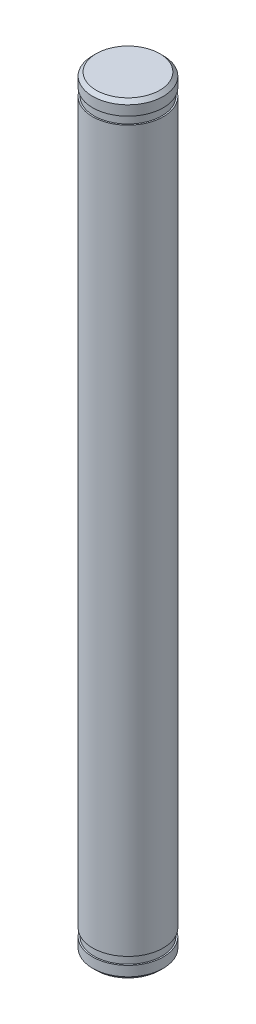
ISO-10303-21;
HEADER;
FILE_DESCRIPTION(('STEP AP214'),'2;1');
FILE_NAME('part.step','',(''),(''),'','','');
FILE_SCHEMA(('AUTOMOTIVE_DESIGN { 1 0 10303 214 1 1 1 1 }'));
ENDSEC;
DATA;
#1=APPLICATION_CONTEXT('core data for automotive mechanical design processes');
#2=APPLICATION_PROTOCOL_DEFINITION('international standard','automotive_design',2000,#1);
#3=PRODUCT_CONTEXT('',#1,'mechanical');
#4=PRODUCT('Part','Part','',(#3));
#5=PRODUCT_RELATED_PRODUCT_CATEGORY('part','',(#4));
#6=PRODUCT_DEFINITION_FORMATION('','',#4);
#7=PRODUCT_DEFINITION_CONTEXT('part definition',#1,'design');
#8=PRODUCT_DEFINITION('design','',#6,#7);
#9=PRODUCT_DEFINITION_SHAPE('','',#8);
#10=(LENGTH_UNIT() NAMED_UNIT(*) SI_UNIT(.MILLI.,.METRE.));
#11=(NAMED_UNIT(*) PLANE_ANGLE_UNIT() SI_UNIT($,.RADIAN.));
#12=(NAMED_UNIT(*) SI_UNIT($,.STERADIAN.) SOLID_ANGLE_UNIT());
#13=UNCERTAINTY_MEASURE_WITH_UNIT(LENGTH_MEASURE(1.E-05),#10,'distance_accuracy_value','');
#14=(GEOMETRIC_REPRESENTATION_CONTEXT(3) GLOBAL_UNCERTAINTY_ASSIGNED_CONTEXT((#13)) GLOBAL_UNIT_ASSIGNED_CONTEXT((#10,
#11,#12)) REPRESENTATION_CONTEXT('',''));
#15=CARTESIAN_POINT('',(0.,0.,0.));
#16=DIRECTION('',(0.,0.,1.));
#17=DIRECTION('',(1.,0.,0.));
#18=AXIS2_PLACEMENT_3D('',#15,#16,#17);
#19=CARTESIAN_POINT('',(0.,108.,0.));
#20=DIRECTION('',(0.,-1.,0.));
#21=DIRECTION('',(0.,0.,-1.));
#22=AXIS2_PLACEMENT_3D('',#19,#20,#21);
#23=CYLINDRICAL_SURFACE('',#22,5.);
#24=CARTESIAN_POINT('',(0.,105.,0.));
#25=DIRECTION('',(0.,1.,0.));
#26=DIRECTION('',(0.,0.,1.));
#27=AXIS2_PLACEMENT_3D('',#24,#25,#26);
#28=CIRCLE('',#27,5.);
#29=CARTESIAN_POINT('',(0.,105.,5.));
#30=VERTEX_POINT('',#29);
#31=EDGE_CURVE('E57',#30,#30,#28,.T.);
#32=ORIENTED_EDGE('',*,*,#31,.F.);
#33=EDGE_LOOP('',(#32));
#34=FACE_BOUND('',#33,.T.);
#35=CARTESIAN_POINT('',(0.,3.,0.));
#36=DIRECTION('',(0.,1.,0.));
#37=DIRECTION('',(0.,0.,1.));
#38=AXIS2_PLACEMENT_3D('',#35,#36,#37);
#39=CIRCLE('',#38,5.);
#40=CARTESIAN_POINT('',(0.,3.,5.));
#41=VERTEX_POINT('',#40);
#42=EDGE_CURVE('E69',#41,#41,#39,.T.);
#43=ORIENTED_EDGE('',*,*,#42,.T.);
#44=EDGE_LOOP('',(#43));
#45=FACE_BOUND('',#44,.T.);
#46=ADVANCED_FACE('F35',(#34,#45),#23,.T.);
#47=CARTESIAN_POINT('',(0.,106.1,0.));
#48=DIRECTION('',(0.,1.,0.));
#49=DIRECTION('',(0.,0.,1.));
#50=AXIS2_PLACEMENT_3D('',#47,#48,#49);
#51=CIRCLE('',#50,5.);
#52=CARTESIAN_POINT('',(0.,106.1,5.));
#53=VERTEX_POINT('',#52);
#54=EDGE_CURVE('E56',#53,#53,#51,.T.);
#55=ORIENTED_EDGE('',*,*,#54,.T.);
#56=EDGE_LOOP('',(#55));
#57=FACE_BOUND('',#56,.T.);
#58=CARTESIAN_POINT('',(0.,107.5,0.));
#59=DIRECTION('',(0.,1.,0.));
#60=DIRECTION('',(0.,0.,1.));
#61=AXIS2_PLACEMENT_3D('',#58,#59,#60);
#62=CIRCLE('',#61,5.);
#63=CARTESIAN_POINT('',(0.,107.5,5.));
#64=VERTEX_POINT('',#63);
#65=EDGE_CURVE('E51',#64,#64,#62,.F.);
#66=ORIENTED_EDGE('',*,*,#65,.T.);
#67=EDGE_LOOP('',(#66));
#68=FACE_BOUND('',#67,.T.);
#69=ADVANCED_FACE('F97',(#57,#68),#23,.T.);
#70=CARTESIAN_POINT('',(0.,108.,0.));
#71=DIRECTION('',(0.,1.,0.));
#72=DIRECTION('',(0.,0.,1.));
#73=AXIS2_PLACEMENT_3D('',#70,#71,#72);
#74=PLANE('',#73);
#75=CARTESIAN_POINT('',(0.,108.,0.));
#76=DIRECTION('',(0.,1.,0.));
#77=DIRECTION('',(0.,0.,1.));
#78=AXIS2_PLACEMENT_3D('',#75,#76,#77);
#79=CIRCLE('',#78,4.50000000000002);
#80=CARTESIAN_POINT('',(0.,108.,4.50000000000002));
#81=VERTEX_POINT('',#80);
#82=EDGE_CURVE('E10',#81,#81,#79,.T.);
#83=ORIENTED_EDGE('',*,*,#82,.T.);
#84=EDGE_LOOP('',(#83));
#85=FACE_BOUND('',#84,.T.);
#86=ADVANCED_FACE('F113',(#85),#74,.T.);
#87=CARTESIAN_POINT('',(0.,108.,0.));
#88=DIRECTION('',(0.,-1.,0.));
#89=DIRECTION('',(0.,0.,-1.));
#90=AXIS2_PLACEMENT_3D('',#87,#88,#89);
#91=CONICAL_SURFACE('',#90,4.50000000000002,0.785398163397444);
#92=ORIENTED_EDGE('',*,*,#65,.F.);
#93=EDGE_LOOP('',(#92));
#94=FACE_BOUND('',#93,.T.);
#95=ORIENTED_EDGE('',*,*,#82,.F.);
#96=EDGE_LOOP('',(#95));
#97=FACE_BOUND('',#96,.T.);
#98=ADVANCED_FACE('F38',(#94,#97),#91,.T.);
#99=CARTESIAN_POINT('',(0.,106.1,0.));
#100=DIRECTION('',(0.,1.,0.));
#101=DIRECTION('',(0.,0.,1.));
#102=AXIS2_PLACEMENT_3D('',#99,#100,#101);
#103=PLANE('',#102);
#104=ORIENTED_EDGE('',*,*,#54,.F.);
#105=EDGE_LOOP('',(#104));
#106=FACE_BOUND('',#105,.T.);
#107=CARTESIAN_POINT('',(0.,106.1,0.));
#108=DIRECTION('',(0.,1.,0.));
#109=DIRECTION('',(0.,0.,1.));
#110=AXIS2_PLACEMENT_3D('',#107,#108,#109);
#111=CIRCLE('',#110,4.8);
#112=CARTESIAN_POINT('',(0.,106.1,4.8));
#113=VERTEX_POINT('',#112);
#114=EDGE_CURVE('E60',#113,#113,#111,.T.);
#115=ORIENTED_EDGE('',*,*,#114,.T.);
#116=EDGE_LOOP('',(#115));
#117=FACE_BOUND('',#116,.T.);
#118=ADVANCED_FACE('F123',(#106,#117),#103,.F.);
#119=CARTESIAN_POINT('',(0.,105.,0.));
#120=DIRECTION('',(0.,1.,0.));
#121=DIRECTION('',(0.,0.,1.));
#122=AXIS2_PLACEMENT_3D('',#119,#120,#121);
#123=PLANE('',#122);
#124=ORIENTED_EDGE('',*,*,#31,.T.);
#125=EDGE_LOOP('',(#124));
#126=FACE_BOUND('',#125,.T.);
#127=CARTESIAN_POINT('',(0.,105.,0.));
#128=DIRECTION('',(0.,1.,0.));
#129=DIRECTION('',(0.,0.,1.));
#130=AXIS2_PLACEMENT_3D('',#127,#128,#129);
#131=CIRCLE('',#130,4.8);
#132=CARTESIAN_POINT('',(0.,105.,4.8));
#133=VERTEX_POINT('',#132);
#134=EDGE_CURVE('E63',#133,#133,#131,.T.);
#135=ORIENTED_EDGE('',*,*,#134,.F.);
#136=EDGE_LOOP('',(#135));
#137=FACE_BOUND('',#136,.T.);
#138=ADVANCED_FACE('F120',(#126,#137),#123,.T.);
#139=CARTESIAN_POINT('',(0.,106.1,0.));
#140=DIRECTION('',(0.,-1.,0.));
#141=DIRECTION('',(0.,0.,-1.));
#142=AXIS2_PLACEMENT_3D('',#139,#140,#141);
#143=CYLINDRICAL_SURFACE('',#142,4.8);
#144=ORIENTED_EDGE('',*,*,#114,.F.);
#145=EDGE_LOOP('',(#144));
#146=FACE_BOUND('',#145,.T.);
#147=ORIENTED_EDGE('',*,*,#134,.T.);
#148=EDGE_LOOP('',(#147));
#149=FACE_BOUND('',#148,.T.);
#150=ADVANCED_FACE('F88',(#146,#149),#143,.T.);
#151=CARTESIAN_POINT('',(0.,1.9,0.));
#152=DIRECTION('',(0.,-1.,0.));
#153=DIRECTION('',(0.,0.,1.));
#154=AXIS2_PLACEMENT_3D('',#151,#152,#153);
#155=PLANE('',#154);
#156=CARTESIAN_POINT('',(0.,1.9,0.));
#157=DIRECTION('',(0.,1.,0.));
#158=DIRECTION('',(0.,0.,1.));
#159=AXIS2_PLACEMENT_3D('',#156,#157,#158);
#160=CIRCLE('',#159,4.8);
#161=CARTESIAN_POINT('',(0.,1.9,4.8));
#162=VERTEX_POINT('',#161);
#163=EDGE_CURVE('E72',#162,#162,#160,.T.);
#164=ORIENTED_EDGE('',*,*,#163,.F.);
#165=EDGE_LOOP('',(#164));
#166=FACE_BOUND('',#165,.T.);
#167=CARTESIAN_POINT('',(0.,1.9,0.));
#168=DIRECTION('',(0.,1.,0.));
#169=DIRECTION('',(0.,0.,1.));
#170=AXIS2_PLACEMENT_3D('',#167,#168,#169);
#171=CIRCLE('',#170,5.);
#172=CARTESIAN_POINT('',(0.,1.9,5.));
#173=VERTEX_POINT('',#172);
#174=EDGE_CURVE('E66',#173,#173,#171,.T.);
#175=ORIENTED_EDGE('',*,*,#174,.T.);
#176=EDGE_LOOP('',(#175));
#177=FACE_BOUND('',#176,.T.);
#178=ADVANCED_FACE('F84',(#166,#177),#155,.F.);
#179=CARTESIAN_POINT('',(0.,3.,0.));
#180=DIRECTION('',(0.,-1.,0.));
#181=DIRECTION('',(0.,0.,1.));
#182=AXIS2_PLACEMENT_3D('',#179,#180,#181);
#183=PLANE('',#182);
#184=CARTESIAN_POINT('',(0.,3.,0.));
#185=DIRECTION('',(0.,1.,0.));
#186=DIRECTION('',(0.,0.,1.));
#187=AXIS2_PLACEMENT_3D('',#184,#185,#186);
#188=CIRCLE('',#187,4.8);
#189=CARTESIAN_POINT('',(0.,3.,4.8));
#190=VERTEX_POINT('',#189);
#191=EDGE_CURVE('E75',#190,#190,#188,.T.);
#192=ORIENTED_EDGE('',*,*,#191,.T.);
#193=EDGE_LOOP('',(#192));
#194=FACE_BOUND('',#193,.T.);
#195=ORIENTED_EDGE('',*,*,#42,.F.);
#196=EDGE_LOOP('',(#195));
#197=FACE_BOUND('',#196,.T.);
#198=ADVANCED_FACE('F87',(#194,#197),#183,.T.);
#199=CARTESIAN_POINT('',(0.,1.9,0.));
#200=DIRECTION('',(0.,1.,0.));
#201=DIRECTION('',(0.,0.,1.));
#202=AXIS2_PLACEMENT_3D('',#199,#200,#201);
#203=CYLINDRICAL_SURFACE('',#202,4.8);
#204=ORIENTED_EDGE('',*,*,#163,.T.);
#205=EDGE_LOOP('',(#204));
#206=FACE_BOUND('',#205,.T.);
#207=ORIENTED_EDGE('',*,*,#191,.F.);
#208=EDGE_LOOP('',(#207));
#209=FACE_BOUND('',#208,.T.);
#210=ADVANCED_FACE('F81',(#206,#209),#203,.T.);
#211=CARTESIAN_POINT('',(0.,0.,0.));
#212=DIRECTION('',(0.,1.,0.));
#213=DIRECTION('',(0.,0.,1.));
#214=AXIS2_PLACEMENT_3D('',#211,#212,#213);
#215=PLANE('',#214);
#216=CARTESIAN_POINT('',(0.,0.,0.));
#217=DIRECTION('',(0.,1.,0.));
#218=DIRECTION('',(0.,0.,1.));
#219=AXIS2_PLACEMENT_3D('',#216,#217,#218);
#220=CIRCLE('',#219,4.49999999999999);
#221=CARTESIAN_POINT('',(0.,0.,4.49999999999999));
#222=VERTEX_POINT('',#221);
#223=EDGE_CURVE('E43',#222,#222,#220,.F.);
#224=ORIENTED_EDGE('',*,*,#223,.T.);
#225=EDGE_LOOP('',(#224));
#226=FACE_BOUND('',#225,.T.);
#227=ADVANCED_FACE('F101',(#226),#215,.F.);
#228=CARTESIAN_POINT('',(0.,0.5,0.));
#229=DIRECTION('',(0.,1.,0.));
#230=DIRECTION('',(0.,0.,1.));
#231=AXIS2_PLACEMENT_3D('',#228,#229,#230);
#232=CONICAL_SURFACE('',#231,5.,0.785398163397458);
#233=ORIENTED_EDGE('',*,*,#223,.F.);
#234=EDGE_LOOP('',(#233));
#235=FACE_BOUND('',#234,.T.);
#236=CARTESIAN_POINT('',(0.,0.5,0.));
#237=DIRECTION('',(0.,1.,0.));
#238=DIRECTION('',(0.,0.,1.));
#239=AXIS2_PLACEMENT_3D('',#236,#237,#238);
#240=CIRCLE('',#239,5.);
#241=CARTESIAN_POINT('',(0.,0.5,5.));
#242=VERTEX_POINT('',#241);
#243=EDGE_CURVE('E47',#242,#242,#240,.T.);
#244=ORIENTED_EDGE('',*,*,#243,.F.);
#245=EDGE_LOOP('',(#244));
#246=FACE_BOUND('',#245,.T.);
#247=ADVANCED_FACE('F95',(#235,#246),#232,.T.);
#248=ORIENTED_EDGE('',*,*,#174,.F.);
#249=EDGE_LOOP('',(#248));
#250=FACE_BOUND('',#249,.T.);
#251=ORIENTED_EDGE('',*,*,#243,.T.);
#252=EDGE_LOOP('',(#251));
#253=FACE_BOUND('',#252,.T.);
#254=ADVANCED_FACE('F92',(#250,#253),#23,.T.);
#255=CLOSED_SHELL('',(#46,#69,#86,#98,#118,#138,#150,#178,#198,#210,#227,#247,#254));
#256=MANIFOLD_SOLID_BREP('B2',#255);
#257=ADVANCED_BREP_SHAPE_REPRESENTATION('',(#18,#256),#14);
#258=SHAPE_DEFINITION_REPRESENTATION(#9,#257);
ENDSEC;
END-ISO-10303-21;
